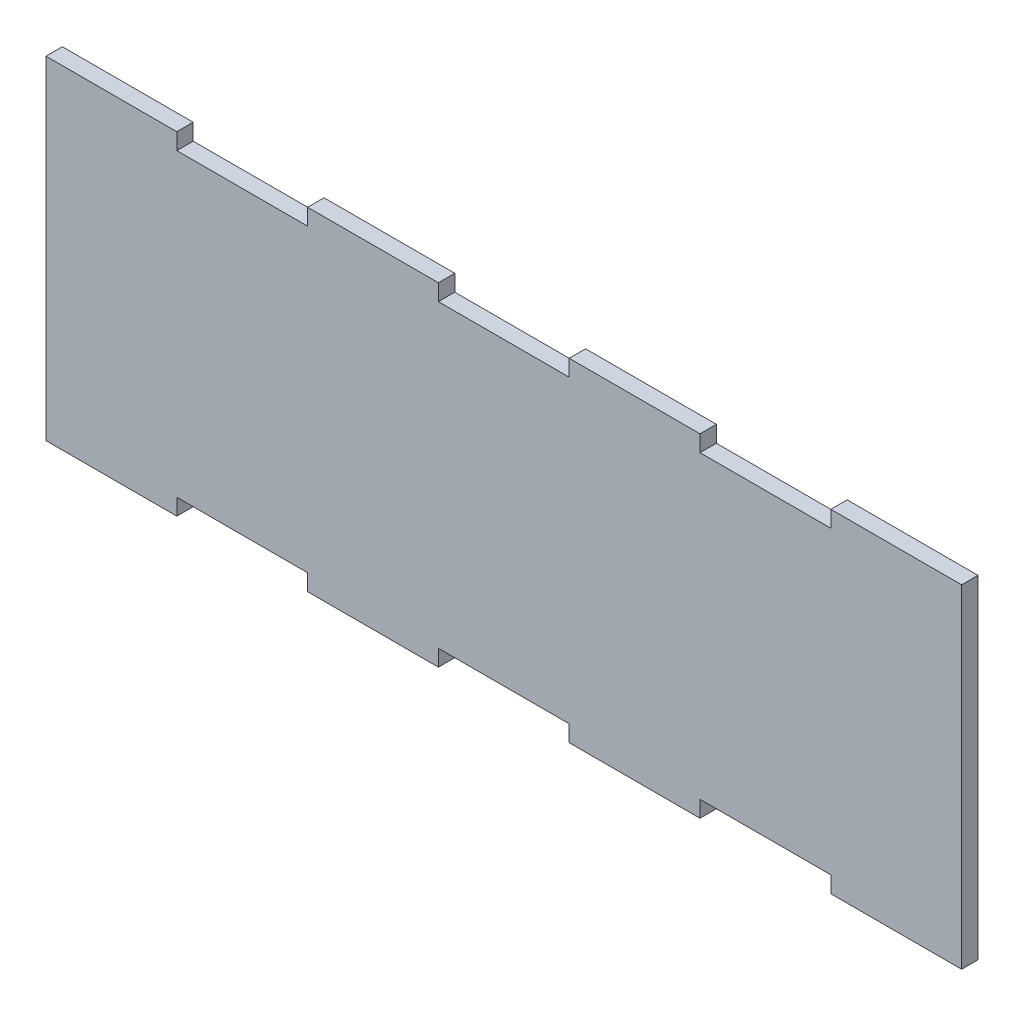
ISO-10303-21;
HEADER;
FILE_DESCRIPTION(('STEP AP214'),'2;1');
FILE_NAME('part.step','',(''),(''),'','','');
FILE_SCHEMA(('AUTOMOTIVE_DESIGN { 1 0 10303 214 1 1 1 1 }'));
ENDSEC;
DATA;
#1=APPLICATION_CONTEXT('core data for automotive mechanical design processes');
#2=APPLICATION_PROTOCOL_DEFINITION('international standard','automotive_design',2000,#1);
#3=PRODUCT_CONTEXT('',#1,'mechanical');
#4=PRODUCT('Part','Part','',(#3));
#5=PRODUCT_RELATED_PRODUCT_CATEGORY('part','',(#4));
#6=PRODUCT_DEFINITION_FORMATION('','',#4);
#7=PRODUCT_DEFINITION_CONTEXT('part definition',#1,'design');
#8=PRODUCT_DEFINITION('design','',#6,#7);
#9=PRODUCT_DEFINITION_SHAPE('','',#8);
#10=(LENGTH_UNIT() NAMED_UNIT(*) SI_UNIT(.MILLI.,.METRE.));
#11=(NAMED_UNIT(*) PLANE_ANGLE_UNIT() SI_UNIT($,.RADIAN.));
#12=(NAMED_UNIT(*) SI_UNIT($,.STERADIAN.) SOLID_ANGLE_UNIT());
#13=UNCERTAINTY_MEASURE_WITH_UNIT(LENGTH_MEASURE(1.E-05),#10,'distance_accuracy_value','');
#14=(GEOMETRIC_REPRESENTATION_CONTEXT(3) GLOBAL_UNCERTAINTY_ASSIGNED_CONTEXT((#13)) GLOBAL_UNIT_ASSIGNED_CONTEXT((#10,
#11,#12)) REPRESENTATION_CONTEXT('',''));
#15=CARTESIAN_POINT('',(0.,0.,0.));
#16=DIRECTION('',(0.,0.,1.));
#17=DIRECTION('',(1.,0.,0.));
#18=AXIS2_PLACEMENT_3D('',#15,#16,#17);
#19=CARTESIAN_POINT('',(-69.85,25.4,2.5));
#20=DIRECTION('',(0.,-1.,0.));
#21=DIRECTION('',(0.,0.,-1.));
#22=AXIS2_PLACEMENT_3D('',#19,#20,#21);
#23=PLANE('',#22);
#24=DIRECTION('',(-1.,0.,0.));
#25=VECTOR('',#24,1.);
#26=CARTESIAN_POINT('',(-69.85,25.4,0.));
#27=LINE('',#26,#25);
#28=CARTESIAN_POINT('',(29.9357142857143,25.4,0.));
#29=VERTEX_POINT('',#28);
#30=CARTESIAN_POINT('',(9.97857142857145,25.4,0.));
#31=VERTEX_POINT('',#30);
#32=EDGE_CURVE('E282',#29,#31,#27,.T.);
#33=ORIENTED_EDGE('',*,*,#32,.T.);
#34=DIRECTION('',(0.,0.,-1.));
#35=VECTOR('',#34,1.);
#36=CARTESIAN_POINT('',(9.97857142857145,25.4,2.54));
#37=LINE('',#36,#35);
#38=CARTESIAN_POINT('',(9.97857142857145,25.4,2.5));
#39=VERTEX_POINT('',#38);
#40=EDGE_CURVE('E377',#39,#31,#37,.T.);
#41=ORIENTED_EDGE('',*,*,#40,.F.);
#42=DIRECTION('',(-1.,0.,0.));
#43=VECTOR('',#42,1.);
#44=CARTESIAN_POINT('',(-69.85,25.4,2.5));
#45=LINE('',#44,#43);
#46=CARTESIAN_POINT('',(29.9357142857143,25.4,2.5));
#47=VERTEX_POINT('',#46);
#48=EDGE_CURVE('E307',#47,#39,#45,.T.);
#49=ORIENTED_EDGE('',*,*,#48,.F.);
#50=DIRECTION('',(0.,0.,-1.));
#51=VECTOR('',#50,1.);
#52=CARTESIAN_POINT('',(29.9357142857143,25.4,2.54));
#53=LINE('',#52,#51);
#54=EDGE_CURVE('E367',#47,#29,#53,.T.);
#55=ORIENTED_EDGE('',*,*,#54,.T.);
#56=EDGE_LOOP('',(#33,#41,#49,#55));
#57=FACE_BOUND('',#56,.T.);
#58=ADVANCED_FACE('F33',(#57),#23,.F.);
#59=CARTESIAN_POINT('',(-9.97857142857141,25.4,2.5));
#60=VERTEX_POINT('',#59);
#61=CARTESIAN_POINT('',(-29.9357142857143,25.4,2.5));
#62=VERTEX_POINT('',#61);
#63=EDGE_CURVE('E733',#60,#62,#45,.T.);
#64=ORIENTED_EDGE('',*,*,#63,.F.);
#65=DIRECTION('',(0.,0.,-1.));
#66=VECTOR('',#65,1.);
#67=CARTESIAN_POINT('',(-9.97857142857141,25.4,2.54));
#68=LINE('',#67,#66);
#69=CARTESIAN_POINT('',(-9.97857142857141,25.4,0.));
#70=VERTEX_POINT('',#69);
#71=EDGE_CURVE('E429',#60,#70,#68,.T.);
#72=ORIENTED_EDGE('',*,*,#71,.T.);
#73=CARTESIAN_POINT('',(-29.9357142857143,25.4,0.));
#74=VERTEX_POINT('',#73);
#75=EDGE_CURVE('E286',#70,#74,#27,.T.);
#76=ORIENTED_EDGE('',*,*,#75,.T.);
#77=DIRECTION('',(0.,0.,-1.));
#78=VECTOR('',#77,1.);
#79=CARTESIAN_POINT('',(-29.9357142857143,25.4,2.54));
#80=LINE('',#79,#78);
#81=EDGE_CURVE('E417',#62,#74,#80,.T.);
#82=ORIENTED_EDGE('',*,*,#81,.F.);
#83=EDGE_LOOP('',(#64,#72,#76,#82));
#84=FACE_BOUND('',#83,.T.);
#85=ADVANCED_FACE('F473',(#84),#23,.F.);
#86=CARTESIAN_POINT('',(69.85,25.4,0.));
#87=VERTEX_POINT('',#86);
#88=CARTESIAN_POINT('',(49.8928571428572,25.4,0.));
#89=VERTEX_POINT('',#88);
#90=EDGE_CURVE('E280',#87,#89,#27,.T.);
#91=ORIENTED_EDGE('',*,*,#90,.T.);
#92=DIRECTION('',(0.,0.,-1.));
#93=VECTOR('',#92,1.);
#94=CARTESIAN_POINT('',(49.8928571428572,25.4,2.54));
#95=LINE('',#94,#93);
#96=CARTESIAN_POINT('',(49.8928571428572,25.4,2.5));
#97=VERTEX_POINT('',#96);
#98=EDGE_CURVE('E360',#97,#89,#95,.T.);
#99=ORIENTED_EDGE('',*,*,#98,.F.);
#100=CARTESIAN_POINT('',(69.85,25.4,2.5));
#101=VERTEX_POINT('',#100);
#102=EDGE_CURVE('E304',#101,#97,#45,.T.);
#103=ORIENTED_EDGE('',*,*,#102,.F.);
#104=DIRECTION('',(0.,0.,-1.));
#105=VECTOR('',#104,1.);
#106=CARTESIAN_POINT('',(69.85,25.4,2.5));
#107=LINE('',#106,#105);
#108=EDGE_CURVE('E11',#101,#87,#107,.T.);
#109=ORIENTED_EDGE('',*,*,#108,.T.);
#110=EDGE_LOOP('',(#91,#99,#103,#109));
#111=FACE_BOUND('',#110,.T.);
#112=ADVANCED_FACE('F469',(#111),#23,.F.);
#113=CARTESIAN_POINT('',(-69.85,-25.4,2.5));
#114=DIRECTION('',(0.,1.,0.));
#115=DIRECTION('',(0.,0.,1.));
#116=AXIS2_PLACEMENT_3D('',#113,#114,#115);
#117=PLANE('',#116);
#118=DIRECTION('',(1.,0.,0.));
#119=VECTOR('',#118,1.);
#120=CARTESIAN_POINT('',(-69.85,-25.4,2.5));
#121=LINE('',#120,#119);
#122=CARTESIAN_POINT('',(49.8928571428572,-25.4,2.5));
#123=VERTEX_POINT('',#122);
#124=CARTESIAN_POINT('',(69.85,-25.4,2.5));
#125=VERTEX_POINT('',#124);
#126=EDGE_CURVE('E302',#123,#125,#121,.T.);
#127=ORIENTED_EDGE('',*,*,#126,.F.);
#128=DIRECTION('',(0.,0.,-1.));
#129=VECTOR('',#128,1.);
#130=CARTESIAN_POINT('',(49.8928571428572,-25.4,2.54));
#131=LINE('',#130,#129);
#132=CARTESIAN_POINT('',(49.8928571428572,-25.4,0.));
#133=VERTEX_POINT('',#132);
#134=EDGE_CURVE('E394',#123,#133,#131,.T.);
#135=ORIENTED_EDGE('',*,*,#134,.T.);
#136=DIRECTION('',(1.,0.,0.));
#137=VECTOR('',#136,1.);
#138=CARTESIAN_POINT('',(-69.85,-25.4,0.));
#139=LINE('',#138,#137);
#140=CARTESIAN_POINT('',(69.85,-25.4,0.));
#141=VERTEX_POINT('',#140);
#142=EDGE_CURVE('E253',#133,#141,#139,.T.);
#143=ORIENTED_EDGE('',*,*,#142,.T.);
#144=DIRECTION('',(0.,0.,-1.));
#145=VECTOR('',#144,1.);
#146=CARTESIAN_POINT('',(69.85,-25.4,2.5));
#147=LINE('',#146,#145);
#148=EDGE_CURVE('E259',#125,#141,#147,.T.);
#149=ORIENTED_EDGE('',*,*,#148,.F.);
#150=EDGE_LOOP('',(#127,#135,#143,#149));
#151=FACE_BOUND('',#150,.T.);
#152=ADVANCED_FACE('F458',(#151),#117,.F.);
#153=CARTESIAN_POINT('',(9.97857142857145,-25.4,0.));
#154=VERTEX_POINT('',#153);
#155=CARTESIAN_POINT('',(29.9357142857143,-25.4,0.));
#156=VERTEX_POINT('',#155);
#157=EDGE_CURVE('E249',#154,#156,#139,.T.);
#158=ORIENTED_EDGE('',*,*,#157,.T.);
#159=DIRECTION('',(0.,0.,-1.));
#160=VECTOR('',#159,1.);
#161=CARTESIAN_POINT('',(29.9357142857143,-25.4,2.54));
#162=LINE('',#161,#160);
#163=CARTESIAN_POINT('',(29.9357142857143,-25.4,2.5));
#164=VERTEX_POINT('',#163);
#165=EDGE_CURVE('E397',#164,#156,#162,.T.);
#166=ORIENTED_EDGE('',*,*,#165,.F.);
#167=CARTESIAN_POINT('',(9.97857142857145,-25.4,2.5));
#168=VERTEX_POINT('',#167);
#169=EDGE_CURVE('E757',#168,#164,#121,.T.);
#170=ORIENTED_EDGE('',*,*,#169,.F.);
#171=DIRECTION('',(0.,0.,-1.));
#172=VECTOR('',#171,1.);
#173=CARTESIAN_POINT('',(9.97857142857145,-25.4,2.54));
#174=LINE('',#173,#172);
#175=EDGE_CURVE('E378',#168,#154,#174,.T.);
#176=ORIENTED_EDGE('',*,*,#175,.T.);
#177=EDGE_LOOP('',(#158,#166,#170,#176));
#178=FACE_BOUND('',#177,.T.);
#179=ADVANCED_FACE('F468',(#178),#117,.F.);
#180=CARTESIAN_POINT('',(-29.9357142857143,-25.4,0.));
#181=VERTEX_POINT('',#180);
#182=CARTESIAN_POINT('',(-9.97857142857141,-25.4,0.));
#183=VERTEX_POINT('',#182);
#184=EDGE_CURVE('E237',#181,#183,#139,.T.);
#185=ORIENTED_EDGE('',*,*,#184,.T.);
#186=DIRECTION('',(0.,0.,-1.));
#187=VECTOR('',#186,1.);
#188=CARTESIAN_POINT('',(-9.97857142857141,-25.4,2.54));
#189=LINE('',#188,#187);
#190=CARTESIAN_POINT('',(-9.97857142857141,-25.4,2.5));
#191=VERTEX_POINT('',#190);
#192=EDGE_CURVE('E381',#191,#183,#189,.T.);
#193=ORIENTED_EDGE('',*,*,#192,.F.);
#194=CARTESIAN_POINT('',(-29.9357142857143,-25.4,2.5));
#195=VERTEX_POINT('',#194);
#196=EDGE_CURVE('E239',#195,#191,#121,.T.);
#197=ORIENTED_EDGE('',*,*,#196,.F.);
#198=DIRECTION('',(0.,0.,-1.));
#199=VECTOR('',#198,1.);
#200=CARTESIAN_POINT('',(-29.9357142857143,-25.4,2.54));
#201=LINE('',#200,#199);
#202=EDGE_CURVE('E222',#195,#181,#201,.T.);
#203=ORIENTED_EDGE('',*,*,#202,.T.);
#204=EDGE_LOOP('',(#185,#193,#197,#203));
#205=FACE_BOUND('',#204,.T.);
#206=ADVANCED_FACE('F235',(#205),#117,.F.);
#207=CARTESIAN_POINT('',(69.85,-25.4,2.5));
#208=DIRECTION('',(-1.,0.,0.));
#209=DIRECTION('',(0.,0.,1.));
#210=AXIS2_PLACEMENT_3D('',#207,#208,#209);
#211=PLANE('',#210);
#212=DIRECTION('',(0.,1.,0.));
#213=VECTOR('',#212,1.);
#214=CARTESIAN_POINT('',(69.85,-25.4,0.));
#215=LINE('',#214,#213);
#216=EDGE_CURVE('E288',#141,#87,#215,.T.);
#217=ORIENTED_EDGE('',*,*,#216,.T.);
#218=ORIENTED_EDGE('',*,*,#108,.F.);
#219=DIRECTION('',(0.,1.,0.));
#220=VECTOR('',#219,1.);
#221=CARTESIAN_POINT('',(69.85,-25.4,2.5));
#222=LINE('',#221,#220);
#223=EDGE_CURVE('E252',#125,#101,#222,.T.);
#224=ORIENTED_EDGE('',*,*,#223,.F.);
#225=ORIENTED_EDGE('',*,*,#148,.T.);
#226=EDGE_LOOP('',(#217,#218,#224,#225));
#227=FACE_BOUND('',#226,.T.);
#228=ADVANCED_FACE('F35',(#227),#211,.F.);
#229=CARTESIAN_POINT('',(-49.8928571428571,25.4,2.5));
#230=VERTEX_POINT('',#229);
#231=CARTESIAN_POINT('',(-69.85,25.4,2.5));
#232=VERTEX_POINT('',#231);
#233=EDGE_CURVE('E308',#230,#232,#45,.T.);
#234=ORIENTED_EDGE('',*,*,#233,.F.);
#235=DIRECTION('',(0.,0.,-1.));
#236=VECTOR('',#235,1.);
#237=CARTESIAN_POINT('',(-49.8928571428571,25.4,2.54));
#238=LINE('',#237,#236);
#239=CARTESIAN_POINT('',(-49.8928571428571,25.4,0.));
#240=VERTEX_POINT('',#239);
#241=EDGE_CURVE('E415',#230,#240,#238,.T.);
#242=ORIENTED_EDGE('',*,*,#241,.T.);
#243=CARTESIAN_POINT('',(-69.85,25.4,0.));
#244=VERTEX_POINT('',#243);
#245=EDGE_CURVE('E278',#240,#244,#27,.T.);
#246=ORIENTED_EDGE('',*,*,#245,.T.);
#247=DIRECTION('',(0.,0.,-1.));
#248=VECTOR('',#247,1.);
#249=CARTESIAN_POINT('',(-69.85,25.4,2.5));
#250=LINE('',#249,#248);
#251=EDGE_CURVE('E41',#232,#244,#250,.T.);
#252=ORIENTED_EDGE('',*,*,#251,.F.);
#253=EDGE_LOOP('',(#234,#242,#246,#252));
#254=FACE_BOUND('',#253,.T.);
#255=ADVANCED_FACE('F464',(#254),#23,.F.);
#256=CARTESIAN_POINT('',(-69.85,-25.4,2.5));
#257=DIRECTION('',(1.,0.,0.));
#258=DIRECTION('',(0.,0.,-1.));
#259=AXIS2_PLACEMENT_3D('',#256,#257,#258);
#260=PLANE('',#259);
#261=DIRECTION('',(0.,-1.,0.));
#262=VECTOR('',#261,1.);
#263=CARTESIAN_POINT('',(-69.85,-25.4,0.));
#264=LINE('',#263,#262);
#265=CARTESIAN_POINT('',(-69.85,-25.4,0.));
#266=VERTEX_POINT('',#265);
#267=EDGE_CURVE('E257',#244,#266,#264,.T.);
#268=ORIENTED_EDGE('',*,*,#267,.T.);
#269=DIRECTION('',(0.,0.,-1.));
#270=VECTOR('',#269,1.);
#271=CARTESIAN_POINT('',(-69.85,-25.4,2.5));
#272=LINE('',#271,#270);
#273=CARTESIAN_POINT('',(-69.85,-25.4,2.5));
#274=VERTEX_POINT('',#273);
#275=EDGE_CURVE('E262',#274,#266,#272,.T.);
#276=ORIENTED_EDGE('',*,*,#275,.F.);
#277=DIRECTION('',(0.,-1.,0.));
#278=VECTOR('',#277,1.);
#279=CARTESIAN_POINT('',(-69.85,-25.4,2.5));
#280=LINE('',#279,#278);
#281=EDGE_CURVE('E272',#232,#274,#280,.T.);
#282=ORIENTED_EDGE('',*,*,#281,.F.);
#283=ORIENTED_EDGE('',*,*,#251,.T.);
#284=EDGE_LOOP('',(#268,#276,#282,#283));
#285=FACE_BOUND('',#284,.T.);
#286=ADVANCED_FACE('F270',(#285),#260,.F.);
#287=CARTESIAN_POINT('',(-49.8928571428571,-25.4,0.));
#288=VERTEX_POINT('',#287);
#289=EDGE_CURVE('E248',#266,#288,#139,.T.);
#290=ORIENTED_EDGE('',*,*,#289,.T.);
#291=DIRECTION('',(0.,0.,-1.));
#292=VECTOR('',#291,1.);
#293=CARTESIAN_POINT('',(-49.8928571428571,-25.4,2.54));
#294=LINE('',#293,#292);
#295=CARTESIAN_POINT('',(-49.8928571428571,-25.4,2.5));
#296=VERTEX_POINT('',#295);
#297=EDGE_CURVE('E240',#296,#288,#294,.T.);
#298=ORIENTED_EDGE('',*,*,#297,.F.);
#299=EDGE_CURVE('E263',#274,#296,#121,.T.);
#300=ORIENTED_EDGE('',*,*,#299,.F.);
#301=ORIENTED_EDGE('',*,*,#275,.T.);
#302=EDGE_LOOP('',(#290,#298,#300,#301));
#303=FACE_BOUND('',#302,.T.);
#304=ADVANCED_FACE('F455',(#303),#117,.F.);
#305=CARTESIAN_POINT('',(0.,0.,2.5));
#306=DIRECTION('',(0.,0.,-1.));
#307=DIRECTION('',(-1.,0.,0.));
#308=AXIS2_PLACEMENT_3D('',#305,#306,#307);
#309=PLANE('',#308);
#310=ORIENTED_EDGE('',*,*,#48,.T.);
#311=DIRECTION('',(0.,-1.,0.));
#312=VECTOR('',#311,1.);
#313=CARTESIAN_POINT('',(9.97857142857145,0.,2.5));
#314=LINE('',#313,#312);
#315=CARTESIAN_POINT('',(9.97857142857145,22.9,2.5));
#316=VERTEX_POINT('',#315);
#317=EDGE_CURVE('E292',#39,#316,#314,.T.);
#318=ORIENTED_EDGE('',*,*,#317,.T.);
#319=DIRECTION('',(-1.,0.,0.));
#320=VECTOR('',#319,1.);
#321=CARTESIAN_POINT('',(0.,22.9,2.5));
#322=LINE('',#321,#320);
#323=CARTESIAN_POINT('',(-9.97857142857141,22.9,2.5));
#324=VERTEX_POINT('',#323);
#325=EDGE_CURVE('E313',#316,#324,#322,.T.);
#326=ORIENTED_EDGE('',*,*,#325,.T.);
#327=DIRECTION('',(0.,1.,0.));
#328=VECTOR('',#327,1.);
#329=CARTESIAN_POINT('',(-9.97857142857141,0.,2.5));
#330=LINE('',#329,#328);
#331=EDGE_CURVE('E297',#324,#60,#330,.T.);
#332=ORIENTED_EDGE('',*,*,#331,.T.);
#333=ORIENTED_EDGE('',*,*,#63,.T.);
#334=DIRECTION('',(0.,-1.,0.));
#335=VECTOR('',#334,1.);
#336=CARTESIAN_POINT('',(-29.9357142857143,0.,2.5));
#337=LINE('',#336,#335);
#338=CARTESIAN_POINT('',(-29.9357142857143,22.9,2.5));
#339=VERTEX_POINT('',#338);
#340=EDGE_CURVE('E316',#62,#339,#337,.T.);
#341=ORIENTED_EDGE('',*,*,#340,.T.);
#342=DIRECTION('',(-1.,0.,0.));
#343=VECTOR('',#342,1.);
#344=CARTESIAN_POINT('',(0.,22.9,2.5));
#345=LINE('',#344,#343);
#346=CARTESIAN_POINT('',(-49.8928571428571,22.9,2.5));
#347=VERTEX_POINT('',#346);
#348=EDGE_CURVE('E322',#339,#347,#345,.T.);
#349=ORIENTED_EDGE('',*,*,#348,.T.);
#350=DIRECTION('',(0.,1.,0.));
#351=VECTOR('',#350,1.);
#352=CARTESIAN_POINT('',(-49.8928571428571,0.,2.5));
#353=LINE('',#352,#351);
#354=EDGE_CURVE('E319',#347,#230,#353,.T.);
#355=ORIENTED_EDGE('',*,*,#354,.T.);
#356=ORIENTED_EDGE('',*,*,#233,.T.);
#357=ORIENTED_EDGE('',*,*,#281,.T.);
#358=ORIENTED_EDGE('',*,*,#299,.T.);
#359=DIRECTION('',(0.,1.,0.));
#360=VECTOR('',#359,1.);
#361=CARTESIAN_POINT('',(-49.8928571428571,0.,2.5));
#362=LINE('',#361,#360);
#363=CARTESIAN_POINT('',(-49.8928571428571,-22.9,2.5));
#364=VERTEX_POINT('',#363);
#365=EDGE_CURVE('E348',#296,#364,#362,.T.);
#366=ORIENTED_EDGE('',*,*,#365,.T.);
#367=DIRECTION('',(1.,0.,0.));
#368=VECTOR('',#367,1.);
#369=CARTESIAN_POINT('',(0.,-22.9,2.5));
#370=LINE('',#369,#368);
#371=CARTESIAN_POINT('',(-29.9357142857143,-22.9,2.5));
#372=VERTEX_POINT('',#371);
#373=EDGE_CURVE('E345',#364,#372,#370,.T.);
#374=ORIENTED_EDGE('',*,*,#373,.T.);
#375=DIRECTION('',(0.,-1.,0.));
#376=VECTOR('',#375,1.);
#377=CARTESIAN_POINT('',(-29.9357142857143,0.,2.5));
#378=LINE('',#377,#376);
#379=EDGE_CURVE('E343',#372,#195,#378,.T.);
#380=ORIENTED_EDGE('',*,*,#379,.T.);
#381=ORIENTED_EDGE('',*,*,#196,.T.);
#382=DIRECTION('',(0.,1.,0.));
#383=VECTOR('',#382,1.);
#384=CARTESIAN_POINT('',(-9.97857142857141,0.,2.5));
#385=LINE('',#384,#383);
#386=CARTESIAN_POINT('',(-9.97857142857141,-22.9,2.5));
#387=VERTEX_POINT('',#386);
#388=EDGE_CURVE('E340',#191,#387,#385,.T.);
#389=ORIENTED_EDGE('',*,*,#388,.T.);
#390=DIRECTION('',(1.,0.,0.));
#391=VECTOR('',#390,1.);
#392=CARTESIAN_POINT('',(0.,-22.9,2.5));
#393=LINE('',#392,#391);
#394=CARTESIAN_POINT('',(9.97857142857145,-22.9,2.5));
#395=VERTEX_POINT('',#394);
#396=EDGE_CURVE('E337',#387,#395,#393,.T.);
#397=ORIENTED_EDGE('',*,*,#396,.T.);
#398=DIRECTION('',(0.,-1.,0.));
#399=VECTOR('',#398,1.);
#400=CARTESIAN_POINT('',(9.97857142857145,0.,2.5));
#401=LINE('',#400,#399);
#402=EDGE_CURVE('E334',#395,#168,#401,.T.);
#403=ORIENTED_EDGE('',*,*,#402,.T.);
#404=ORIENTED_EDGE('',*,*,#169,.T.);
#405=DIRECTION('',(0.,1.,0.));
#406=VECTOR('',#405,1.);
#407=CARTESIAN_POINT('',(29.9357142857143,0.,2.5));
#408=LINE('',#407,#406);
#409=CARTESIAN_POINT('',(29.9357142857143,-22.9,2.5));
#410=VERTEX_POINT('',#409);
#411=EDGE_CURVE('E331',#164,#410,#408,.T.);
#412=ORIENTED_EDGE('',*,*,#411,.T.);
#413=DIRECTION('',(1.,0.,0.));
#414=VECTOR('',#413,1.);
#415=CARTESIAN_POINT('',(0.,-22.9,2.5));
#416=LINE('',#415,#414);
#417=CARTESIAN_POINT('',(49.8928571428572,-22.9,2.5));
#418=VERTEX_POINT('',#417);
#419=EDGE_CURVE('E328',#410,#418,#416,.T.);
#420=ORIENTED_EDGE('',*,*,#419,.T.);
#421=DIRECTION('',(0.,-1.,0.));
#422=VECTOR('',#421,1.);
#423=CARTESIAN_POINT('',(49.8928571428572,0.,2.5));
#424=LINE('',#423,#422);
#425=EDGE_CURVE('E325',#418,#123,#424,.T.);
#426=ORIENTED_EDGE('',*,*,#425,.T.);
#427=ORIENTED_EDGE('',*,*,#126,.T.);
#428=ORIENTED_EDGE('',*,*,#223,.T.);
#429=ORIENTED_EDGE('',*,*,#102,.T.);
#430=DIRECTION('',(0.,-1.,0.));
#431=VECTOR('',#430,1.);
#432=CARTESIAN_POINT('',(49.8928571428572,0.,2.5));
#433=LINE('',#432,#431);
#434=CARTESIAN_POINT('',(49.8928571428572,22.9,2.5));
#435=VERTEX_POINT('',#434);
#436=EDGE_CURVE('E351',#97,#435,#433,.T.);
#437=ORIENTED_EDGE('',*,*,#436,.T.);
#438=DIRECTION('',(-1.,0.,0.));
#439=VECTOR('',#438,1.);
#440=CARTESIAN_POINT('',(0.,22.9,2.5));
#441=LINE('',#440,#439);
#442=CARTESIAN_POINT('',(29.9357142857143,22.9,2.5));
#443=VERTEX_POINT('',#442);
#444=EDGE_CURVE('E357',#435,#443,#441,.T.);
#445=ORIENTED_EDGE('',*,*,#444,.T.);
#446=DIRECTION('',(0.,1.,0.));
#447=VECTOR('',#446,1.);
#448=CARTESIAN_POINT('',(29.9357142857143,0.,2.5));
#449=LINE('',#448,#447);
#450=EDGE_CURVE('E354',#443,#47,#449,.T.);
#451=ORIENTED_EDGE('',*,*,#450,.T.);
#452=EDGE_LOOP('',(#310,#318,#326,#332,#333,#341,#349,#355,#356,#357,#358,#366,#374,#380,#381,
#389,#397,#403,#404,#412,#420,#426,#427,#428,#429,#437,#445,#451));
#453=FACE_BOUND('',#452,.T.);
#454=ADVANCED_FACE('F452',(#453),#309,.F.);
#455=CARTESIAN_POINT('',(0.,0.,0.));
#456=DIRECTION('',(0.,0.,-1.));
#457=DIRECTION('',(-1.,0.,0.));
#458=AXIS2_PLACEMENT_3D('',#455,#456,#457);
#459=PLANE('',#458);
#460=DIRECTION('',(0.,-1.,0.));
#461=VECTOR('',#460,1.);
#462=CARTESIAN_POINT('',(9.97857142857145,25.4,0.));
#463=LINE('',#462,#461);
#464=CARTESIAN_POINT('',(9.97857142857145,22.9,0.));
#465=VERTEX_POINT('',#464);
#466=EDGE_CURVE('E48',#31,#465,#463,.T.);
#467=ORIENTED_EDGE('',*,*,#466,.F.);
#468=ORIENTED_EDGE('',*,*,#32,.F.);
#469=DIRECTION('',(0.,1.,0.));
#470=VECTOR('',#469,1.);
#471=CARTESIAN_POINT('',(29.9357142857143,25.4,0.));
#472=LINE('',#471,#470);
#473=CARTESIAN_POINT('',(29.9357142857143,22.9,0.));
#474=VERTEX_POINT('',#473);
#475=EDGE_CURVE('E365',#474,#29,#472,.T.);
#476=ORIENTED_EDGE('',*,*,#475,.F.);
#477=DIRECTION('',(-1.,0.,0.));
#478=VECTOR('',#477,1.);
#479=CARTESIAN_POINT('',(49.8928571428572,22.9,0.));
#480=LINE('',#479,#478);
#481=CARTESIAN_POINT('',(49.8928571428572,22.9,0.));
#482=VERTEX_POINT('',#481);
#483=EDGE_CURVE('E372',#482,#474,#480,.T.);
#484=ORIENTED_EDGE('',*,*,#483,.F.);
#485=DIRECTION('',(0.,-1.,0.));
#486=VECTOR('',#485,1.);
#487=CARTESIAN_POINT('',(49.8928571428572,25.4,0.));
#488=LINE('',#487,#486);
#489=EDGE_CURVE('E375',#89,#482,#488,.T.);
#490=ORIENTED_EDGE('',*,*,#489,.F.);
#491=ORIENTED_EDGE('',*,*,#90,.F.);
#492=ORIENTED_EDGE('',*,*,#216,.F.);
#493=ORIENTED_EDGE('',*,*,#142,.F.);
#494=DIRECTION('',(0.,-1.,0.));
#495=VECTOR('',#494,1.);
#496=CARTESIAN_POINT('',(49.8928571428572,-22.9,0.));
#497=LINE('',#496,#495);
#498=CARTESIAN_POINT('',(49.8928571428572,-22.9,0.));
#499=VERTEX_POINT('',#498);
#500=EDGE_CURVE('E388',#499,#133,#497,.T.);
#501=ORIENTED_EDGE('',*,*,#500,.F.);
#502=DIRECTION('',(1.,0.,0.));
#503=VECTOR('',#502,1.);
#504=CARTESIAN_POINT('',(49.8928571428572,-22.9,0.));
#505=LINE('',#504,#503);
#506=CARTESIAN_POINT('',(29.9357142857143,-22.9,0.));
#507=VERTEX_POINT('',#506);
#508=EDGE_CURVE('E398',#507,#499,#505,.T.);
#509=ORIENTED_EDGE('',*,*,#508,.F.);
#510=DIRECTION('',(0.,1.,0.));
#511=VECTOR('',#510,1.);
#512=CARTESIAN_POINT('',(29.9357142857143,-22.9,0.));
#513=LINE('',#512,#511);
#514=EDGE_CURVE('E406',#156,#507,#513,.T.);
#515=ORIENTED_EDGE('',*,*,#514,.F.);
#516=ORIENTED_EDGE('',*,*,#157,.F.);
#517=DIRECTION('',(0.,-1.,0.));
#518=VECTOR('',#517,1.);
#519=CARTESIAN_POINT('',(9.97857142857145,-22.9,0.));
#520=LINE('',#519,#518);
#521=CARTESIAN_POINT('',(9.97857142857145,-22.9,0.));
#522=VERTEX_POINT('',#521);
#523=EDGE_CURVE('E392',#522,#154,#520,.T.);
#524=ORIENTED_EDGE('',*,*,#523,.F.);
#525=DIRECTION('',(1.,0.,0.));
#526=VECTOR('',#525,1.);
#527=CARTESIAN_POINT('',(9.97857142857145,-22.9,0.));
#528=LINE('',#527,#526);
#529=CARTESIAN_POINT('',(-9.97857142857141,-22.9,0.));
#530=VERTEX_POINT('',#529);
#531=EDGE_CURVE('E382',#530,#522,#528,.T.);
#532=ORIENTED_EDGE('',*,*,#531,.F.);
#533=DIRECTION('',(0.,1.,0.));
#534=VECTOR('',#533,1.);
#535=CARTESIAN_POINT('',(-9.97857142857141,-22.9,0.));
#536=LINE('',#535,#534);
#537=EDGE_CURVE('E247',#183,#530,#536,.T.);
#538=ORIENTED_EDGE('',*,*,#537,.F.);
#539=ORIENTED_EDGE('',*,*,#184,.F.);
#540=DIRECTION('',(0.,-1.,0.));
#541=VECTOR('',#540,1.);
#542=CARTESIAN_POINT('',(-29.9357142857143,-22.9,0.));
#543=LINE('',#542,#541);
#544=CARTESIAN_POINT('',(-29.9357142857143,-22.9,0.));
#545=VERTEX_POINT('',#544);
#546=EDGE_CURVE('E219',#545,#181,#543,.T.);
#547=ORIENTED_EDGE('',*,*,#546,.F.);
#548=DIRECTION('',(1.,0.,0.));
#549=VECTOR('',#548,1.);
#550=CARTESIAN_POINT('',(-29.9357142857143,-22.9,0.));
#551=LINE('',#550,#549);
#552=CARTESIAN_POINT('',(-49.8928571428571,-22.9,0.));
#553=VERTEX_POINT('',#552);
#554=EDGE_CURVE('E241',#553,#545,#551,.T.);
#555=ORIENTED_EDGE('',*,*,#554,.F.);
#556=DIRECTION('',(0.,1.,0.));
#557=VECTOR('',#556,1.);
#558=CARTESIAN_POINT('',(-49.8928571428571,-22.9,0.));
#559=LINE('',#558,#557);
#560=EDGE_CURVE('E230',#288,#553,#559,.T.);
#561=ORIENTED_EDGE('',*,*,#560,.F.);
#562=ORIENTED_EDGE('',*,*,#289,.F.);
#563=ORIENTED_EDGE('',*,*,#267,.F.);
#564=ORIENTED_EDGE('',*,*,#245,.F.);
#565=DIRECTION('',(0.,1.,0.));
#566=VECTOR('',#565,1.);
#567=CARTESIAN_POINT('',(-49.8928571428571,25.4,0.));
#568=LINE('',#567,#566);
#569=CARTESIAN_POINT('',(-49.8928571428571,22.9,0.));
#570=VERTEX_POINT('',#569);
#571=EDGE_CURVE('E413',#570,#240,#568,.T.);
#572=ORIENTED_EDGE('',*,*,#571,.F.);
#573=DIRECTION('',(-1.,0.,0.));
#574=VECTOR('',#573,1.);
#575=CARTESIAN_POINT('',(-29.9357142857143,22.9,0.));
#576=LINE('',#575,#574);
#577=CARTESIAN_POINT('',(-29.9357142857143,22.9,0.));
#578=VERTEX_POINT('',#577);
#579=EDGE_CURVE('E420',#578,#570,#576,.T.);
#580=ORIENTED_EDGE('',*,*,#579,.F.);
#581=DIRECTION('',(0.,-1.,0.));
#582=VECTOR('',#581,1.);
#583=CARTESIAN_POINT('',(-29.9357142857143,25.4,0.));
#584=LINE('',#583,#582);
#585=EDGE_CURVE('E56',#74,#578,#584,.T.);
#586=ORIENTED_EDGE('',*,*,#585,.F.);
#587=ORIENTED_EDGE('',*,*,#75,.F.);
#588=DIRECTION('',(0.,1.,0.));
#589=VECTOR('',#588,1.);
#590=CARTESIAN_POINT('',(-9.97857142857141,25.4,0.));
#591=LINE('',#590,#589);
#592=CARTESIAN_POINT('',(-9.97857142857141,22.9,0.));
#593=VERTEX_POINT('',#592);
#594=EDGE_CURVE('E427',#593,#70,#591,.T.);
#595=ORIENTED_EDGE('',*,*,#594,.F.);
#596=DIRECTION('',(-1.,0.,0.));
#597=VECTOR('',#596,1.);
#598=CARTESIAN_POINT('',(9.97857142857145,22.9,0.));
#599=LINE('',#598,#597);
#600=EDGE_CURVE('E434',#465,#593,#599,.T.);
#601=ORIENTED_EDGE('',*,*,#600,.F.);
#602=EDGE_LOOP('',(#467,#468,#476,#484,#490,#491,#492,#493,#501,#509,#515,#516,#524,#532,#538,
#539,#547,#555,#561,#562,#563,#564,#572,#580,#586,#587,#595,#601));
#603=FACE_BOUND('',#602,.T.);
#604=ADVANCED_FACE('F244',(#603),#459,.T.);
#605=CARTESIAN_POINT('',(49.8928571428572,25.4,2.54));
#606=DIRECTION('',(1.,0.,0.));
#607=DIRECTION('',(0.,0.,-1.));
#608=AXIS2_PLACEMENT_3D('',#605,#606,#607);
#609=PLANE('',#608);
#610=ORIENTED_EDGE('',*,*,#98,.T.);
#611=ORIENTED_EDGE('',*,*,#489,.T.);
#612=DIRECTION('',(0.,0.,-1.));
#613=VECTOR('',#612,1.);
#614=CARTESIAN_POINT('',(49.8928571428572,22.9,2.54));
#615=LINE('',#614,#613);
#616=EDGE_CURVE('E361',#435,#482,#615,.T.);
#617=ORIENTED_EDGE('',*,*,#616,.F.);
#618=ORIENTED_EDGE('',*,*,#436,.F.);
#619=EDGE_LOOP('',(#610,#611,#617,#618));
#620=FACE_BOUND('',#619,.T.);
#621=ADVANCED_FACE('F541',(#620),#609,.F.);
#622=CARTESIAN_POINT('',(29.9357142857143,25.4,2.54));
#623=DIRECTION('',(-1.,0.,0.));
#624=DIRECTION('',(0.,-1.,0.));
#625=AXIS2_PLACEMENT_3D('',#622,#623,#624);
#626=PLANE('',#625);
#627=DIRECTION('',(0.,0.,-1.));
#628=VECTOR('',#627,1.);
#629=CARTESIAN_POINT('',(29.9357142857143,22.9,2.54));
#630=LINE('',#629,#628);
#631=EDGE_CURVE('E364',#443,#474,#630,.T.);
#632=ORIENTED_EDGE('',*,*,#631,.T.);
#633=ORIENTED_EDGE('',*,*,#475,.T.);
#634=ORIENTED_EDGE('',*,*,#54,.F.);
#635=ORIENTED_EDGE('',*,*,#450,.F.);
#636=EDGE_LOOP('',(#632,#633,#634,#635));
#637=FACE_BOUND('',#636,.T.);
#638=ADVANCED_FACE('F559',(#637),#626,.F.);
#639=CARTESIAN_POINT('',(49.8928571428572,22.9,2.54));
#640=DIRECTION('',(0.,-1.,0.));
#641=DIRECTION('',(0.,0.,-1.));
#642=AXIS2_PLACEMENT_3D('',#639,#640,#641);
#643=PLANE('',#642);
#644=ORIENTED_EDGE('',*,*,#616,.T.);
#645=ORIENTED_EDGE('',*,*,#483,.T.);
#646=ORIENTED_EDGE('',*,*,#631,.F.);
#647=ORIENTED_EDGE('',*,*,#444,.F.);
#648=EDGE_LOOP('',(#644,#645,#646,#647));
#649=FACE_BOUND('',#648,.T.);
#650=ADVANCED_FACE('F566',(#649),#643,.F.);
#651=CARTESIAN_POINT('',(-29.9357142857143,-22.9,2.54));
#652=DIRECTION('',(1.,0.,0.));
#653=DIRECTION('',(0.,0.,-1.));
#654=AXIS2_PLACEMENT_3D('',#651,#652,#653);
#655=PLANE('',#654);
#656=DIRECTION('',(0.,0.,-1.));
#657=VECTOR('',#656,1.);
#658=CARTESIAN_POINT('',(-29.9357142857143,-22.9,2.54));
#659=LINE('',#658,#657);
#660=EDGE_CURVE('E225',#372,#545,#659,.T.);
#661=ORIENTED_EDGE('',*,*,#660,.T.);
#662=ORIENTED_EDGE('',*,*,#546,.T.);
#663=ORIENTED_EDGE('',*,*,#202,.F.);
#664=ORIENTED_EDGE('',*,*,#379,.F.);
#665=EDGE_LOOP('',(#661,#662,#663,#664));
#666=FACE_BOUND('',#665,.T.);
#667=ADVANCED_FACE('F221',(#666),#655,.F.);
#668=CARTESIAN_POINT('',(-29.9357142857143,-22.9,2.54));
#669=DIRECTION('',(0.,1.,0.));
#670=DIRECTION('',(0.,0.,1.));
#671=AXIS2_PLACEMENT_3D('',#668,#669,#670);
#672=PLANE('',#671);
#673=DIRECTION('',(0.,0.,-1.));
#674=VECTOR('',#673,1.);
#675=CARTESIAN_POINT('',(-49.8928571428571,-22.9,2.54));
#676=LINE('',#675,#674);
#677=EDGE_CURVE('E439',#364,#553,#676,.T.);
#678=ORIENTED_EDGE('',*,*,#677,.T.);
#679=ORIENTED_EDGE('',*,*,#554,.T.);
#680=ORIENTED_EDGE('',*,*,#660,.F.);
#681=ORIENTED_EDGE('',*,*,#373,.F.);
#682=EDGE_LOOP('',(#678,#679,#680,#681));
#683=FACE_BOUND('',#682,.T.);
#684=ADVANCED_FACE('F449',(#683),#672,.F.);
#685=CARTESIAN_POINT('',(-49.8928571428571,-22.9,2.54));
#686=DIRECTION('',(-1.,0.,0.));
#687=DIRECTION('',(0.,0.,1.));
#688=AXIS2_PLACEMENT_3D('',#685,#686,#687);
#689=PLANE('',#688);
#690=ORIENTED_EDGE('',*,*,#297,.T.);
#691=ORIENTED_EDGE('',*,*,#560,.T.);
#692=ORIENTED_EDGE('',*,*,#677,.F.);
#693=ORIENTED_EDGE('',*,*,#365,.F.);
#694=EDGE_LOOP('',(#690,#691,#692,#693));
#695=FACE_BOUND('',#694,.T.);
#696=ADVANCED_FACE('F446',(#695),#689,.F.);
#697=CARTESIAN_POINT('',(9.97857142857145,-22.9,2.54));
#698=DIRECTION('',(1.,0.,0.));
#699=DIRECTION('',(0.,0.,-1.));
#700=AXIS2_PLACEMENT_3D('',#697,#698,#699);
#701=PLANE('',#700);
#702=DIRECTION('',(0.,0.,-1.));
#703=VECTOR('',#702,1.);
#704=CARTESIAN_POINT('',(9.97857142857145,-22.9,2.54));
#705=LINE('',#704,#703);
#706=EDGE_CURVE('E386',#395,#522,#705,.T.);
#707=ORIENTED_EDGE('',*,*,#706,.T.);
#708=ORIENTED_EDGE('',*,*,#523,.T.);
#709=ORIENTED_EDGE('',*,*,#175,.F.);
#710=ORIENTED_EDGE('',*,*,#402,.F.);
#711=EDGE_LOOP('',(#707,#708,#709,#710));
#712=FACE_BOUND('',#711,.T.);
#713=ADVANCED_FACE('F593',(#712),#701,.F.);
#714=CARTESIAN_POINT('',(9.97857142857145,-22.9,2.54));
#715=DIRECTION('',(0.,1.,0.));
#716=DIRECTION('',(0.,0.,1.));
#717=AXIS2_PLACEMENT_3D('',#714,#715,#716);
#718=PLANE('',#717);
#719=DIRECTION('',(0.,0.,-1.));
#720=VECTOR('',#719,1.);
#721=CARTESIAN_POINT('',(-9.97857142857141,-22.9,2.54));
#722=LINE('',#721,#720);
#723=EDGE_CURVE('E384',#387,#530,#722,.T.);
#724=ORIENTED_EDGE('',*,*,#723,.T.);
#725=ORIENTED_EDGE('',*,*,#531,.T.);
#726=ORIENTED_EDGE('',*,*,#706,.F.);
#727=ORIENTED_EDGE('',*,*,#396,.F.);
#728=EDGE_LOOP('',(#724,#725,#726,#727));
#729=FACE_BOUND('',#728,.T.);
#730=ADVANCED_FACE('F600',(#729),#718,.F.);
#731=CARTESIAN_POINT('',(-9.97857142857141,-22.9,2.54));
#732=DIRECTION('',(-1.,0.,0.));
#733=DIRECTION('',(0.,0.,1.));
#734=AXIS2_PLACEMENT_3D('',#731,#732,#733);
#735=PLANE('',#734);
#736=ORIENTED_EDGE('',*,*,#192,.T.);
#737=ORIENTED_EDGE('',*,*,#537,.T.);
#738=ORIENTED_EDGE('',*,*,#723,.F.);
#739=ORIENTED_EDGE('',*,*,#388,.F.);
#740=EDGE_LOOP('',(#736,#737,#738,#739));
#741=FACE_BOUND('',#740,.T.);
#742=ADVANCED_FACE('F608',(#741),#735,.F.);
#743=CARTESIAN_POINT('',(49.8928571428572,-22.9,2.54));
#744=DIRECTION('',(1.,0.,0.));
#745=DIRECTION('',(0.,0.,-1.));
#746=AXIS2_PLACEMENT_3D('',#743,#744,#745);
#747=PLANE('',#746);
#748=DIRECTION('',(0.,0.,-1.));
#749=VECTOR('',#748,1.);
#750=CARTESIAN_POINT('',(49.8928571428572,-22.9,2.54));
#751=LINE('',#750,#749);
#752=EDGE_CURVE('E402',#418,#499,#751,.T.);
#753=ORIENTED_EDGE('',*,*,#752,.T.);
#754=ORIENTED_EDGE('',*,*,#500,.T.);
#755=ORIENTED_EDGE('',*,*,#134,.F.);
#756=ORIENTED_EDGE('',*,*,#425,.F.);
#757=EDGE_LOOP('',(#753,#754,#755,#756));
#758=FACE_BOUND('',#757,.T.);
#759=ADVANCED_FACE('F616',(#758),#747,.F.);
#760=CARTESIAN_POINT('',(49.8928571428572,-22.9,2.54));
#761=DIRECTION('',(0.,1.,0.));
#762=DIRECTION('',(0.,0.,1.));
#763=AXIS2_PLACEMENT_3D('',#760,#761,#762);
#764=PLANE('',#763);
#765=DIRECTION('',(0.,0.,-1.));
#766=VECTOR('',#765,1.);
#767=CARTESIAN_POINT('',(29.9357142857143,-22.9,2.54));
#768=LINE('',#767,#766);
#769=EDGE_CURVE('E400',#410,#507,#768,.T.);
#770=ORIENTED_EDGE('',*,*,#769,.T.);
#771=ORIENTED_EDGE('',*,*,#508,.T.);
#772=ORIENTED_EDGE('',*,*,#752,.F.);
#773=ORIENTED_EDGE('',*,*,#419,.F.);
#774=EDGE_LOOP('',(#770,#771,#772,#773));
#775=FACE_BOUND('',#774,.T.);
#776=ADVANCED_FACE('F624',(#775),#764,.F.);
#777=CARTESIAN_POINT('',(29.9357142857143,-22.9,2.54));
#778=DIRECTION('',(-1.,0.,0.));
#779=DIRECTION('',(0.,0.,1.));
#780=AXIS2_PLACEMENT_3D('',#777,#778,#779);
#781=PLANE('',#780);
#782=ORIENTED_EDGE('',*,*,#165,.T.);
#783=ORIENTED_EDGE('',*,*,#514,.T.);
#784=ORIENTED_EDGE('',*,*,#769,.F.);
#785=ORIENTED_EDGE('',*,*,#411,.F.);
#786=EDGE_LOOP('',(#782,#783,#784,#785));
#787=FACE_BOUND('',#786,.T.);
#788=ADVANCED_FACE('F632',(#787),#781,.F.);
#789=CARTESIAN_POINT('',(-29.9357142857143,25.4,2.54));
#790=DIRECTION('',(1.,0.,0.));
#791=DIRECTION('',(0.,0.,-1.));
#792=AXIS2_PLACEMENT_3D('',#789,#790,#791);
#793=PLANE('',#792);
#794=ORIENTED_EDGE('',*,*,#81,.T.);
#795=ORIENTED_EDGE('',*,*,#585,.T.);
#796=DIRECTION('',(0.,0.,-1.));
#797=VECTOR('',#796,1.);
#798=CARTESIAN_POINT('',(-29.9357142857143,22.9,2.54));
#799=LINE('',#798,#797);
#800=EDGE_CURVE('E410',#339,#578,#799,.T.);
#801=ORIENTED_EDGE('',*,*,#800,.F.);
#802=ORIENTED_EDGE('',*,*,#340,.F.);
#803=EDGE_LOOP('',(#794,#795,#801,#802));
#804=FACE_BOUND('',#803,.T.);
#805=ADVANCED_FACE('F640',(#804),#793,.F.);
#806=CARTESIAN_POINT('',(-49.8928571428571,25.4,2.54));
#807=DIRECTION('',(-1.,0.,0.));
#808=DIRECTION('',(0.,0.,1.));
#809=AXIS2_PLACEMENT_3D('',#806,#807,#808);
#810=PLANE('',#809);
#811=DIRECTION('',(0.,0.,-1.));
#812=VECTOR('',#811,1.);
#813=CARTESIAN_POINT('',(-49.8928571428571,22.9,2.54));
#814=LINE('',#813,#812);
#815=EDGE_CURVE('E412',#347,#570,#814,.T.);
#816=ORIENTED_EDGE('',*,*,#815,.T.);
#817=ORIENTED_EDGE('',*,*,#571,.T.);
#818=ORIENTED_EDGE('',*,*,#241,.F.);
#819=ORIENTED_EDGE('',*,*,#354,.F.);
#820=EDGE_LOOP('',(#816,#817,#818,#819));
#821=FACE_BOUND('',#820,.T.);
#822=ADVANCED_FACE('F648',(#821),#810,.F.);
#823=CARTESIAN_POINT('',(-29.9357142857143,22.9,2.54));
#824=DIRECTION('',(0.,-1.,0.));
#825=DIRECTION('',(0.,0.,-1.));
#826=AXIS2_PLACEMENT_3D('',#823,#824,#825);
#827=PLANE('',#826);
#828=ORIENTED_EDGE('',*,*,#800,.T.);
#829=ORIENTED_EDGE('',*,*,#579,.T.);
#830=ORIENTED_EDGE('',*,*,#815,.F.);
#831=ORIENTED_EDGE('',*,*,#348,.F.);
#832=EDGE_LOOP('',(#828,#829,#830,#831));
#833=FACE_BOUND('',#832,.T.);
#834=ADVANCED_FACE('F655',(#833),#827,.F.);
#835=CARTESIAN_POINT('',(9.97857142857145,25.4,2.54));
#836=DIRECTION('',(1.,0.,0.));
#837=DIRECTION('',(0.,0.,-1.));
#838=AXIS2_PLACEMENT_3D('',#835,#836,#837);
#839=PLANE('',#838);
#840=ORIENTED_EDGE('',*,*,#40,.T.);
#841=ORIENTED_EDGE('',*,*,#466,.T.);
#842=DIRECTION('',(0.,0.,-1.));
#843=VECTOR('',#842,1.);
#844=CARTESIAN_POINT('',(9.97857142857145,22.9,2.54));
#845=LINE('',#844,#843);
#846=EDGE_CURVE('E424',#316,#465,#845,.T.);
#847=ORIENTED_EDGE('',*,*,#846,.F.);
#848=ORIENTED_EDGE('',*,*,#317,.F.);
#849=EDGE_LOOP('',(#840,#841,#847,#848));
#850=FACE_BOUND('',#849,.T.);
#851=ADVANCED_FACE('F663',(#850),#839,.F.);
#852=CARTESIAN_POINT('',(-9.97857142857141,25.4,2.54));
#853=DIRECTION('',(-1.,0.,0.));
#854=DIRECTION('',(0.,0.,1.));
#855=AXIS2_PLACEMENT_3D('',#852,#853,#854);
#856=PLANE('',#855);
#857=DIRECTION('',(0.,0.,-1.));
#858=VECTOR('',#857,1.);
#859=CARTESIAN_POINT('',(-9.97857142857141,22.9,2.54));
#860=LINE('',#859,#858);
#861=EDGE_CURVE('E426',#324,#593,#860,.T.);
#862=ORIENTED_EDGE('',*,*,#861,.T.);
#863=ORIENTED_EDGE('',*,*,#594,.T.);
#864=ORIENTED_EDGE('',*,*,#71,.F.);
#865=ORIENTED_EDGE('',*,*,#331,.F.);
#866=EDGE_LOOP('',(#862,#863,#864,#865));
#867=FACE_BOUND('',#866,.T.);
#868=ADVANCED_FACE('F671',(#867),#856,.F.);
#869=CARTESIAN_POINT('',(9.97857142857145,22.9,2.54));
#870=DIRECTION('',(0.,-1.,0.));
#871=DIRECTION('',(0.,0.,-1.));
#872=AXIS2_PLACEMENT_3D('',#869,#870,#871);
#873=PLANE('',#872);
#874=ORIENTED_EDGE('',*,*,#846,.T.);
#875=ORIENTED_EDGE('',*,*,#600,.T.);
#876=ORIENTED_EDGE('',*,*,#861,.F.);
#877=ORIENTED_EDGE('',*,*,#325,.F.);
#878=EDGE_LOOP('',(#874,#875,#876,#877));
#879=FACE_BOUND('',#878,.T.);
#880=ADVANCED_FACE('F678',(#879),#873,.F.);
#881=CLOSED_SHELL('',(#58,#85,#112,#152,#179,#206,#228,#255,#286,#304,#454,#604,#621,#638,#650,
#667,#684,#696,#713,#730,#742,#759,#776,#788,#805,#822,#834,#851,#868,#880));
#882=MANIFOLD_SOLID_BREP('B2',#881);
#883=ADVANCED_BREP_SHAPE_REPRESENTATION('',(#18,#882),#14);
#884=SHAPE_DEFINITION_REPRESENTATION(#9,#883);
ENDSEC;
END-ISO-10303-21;
